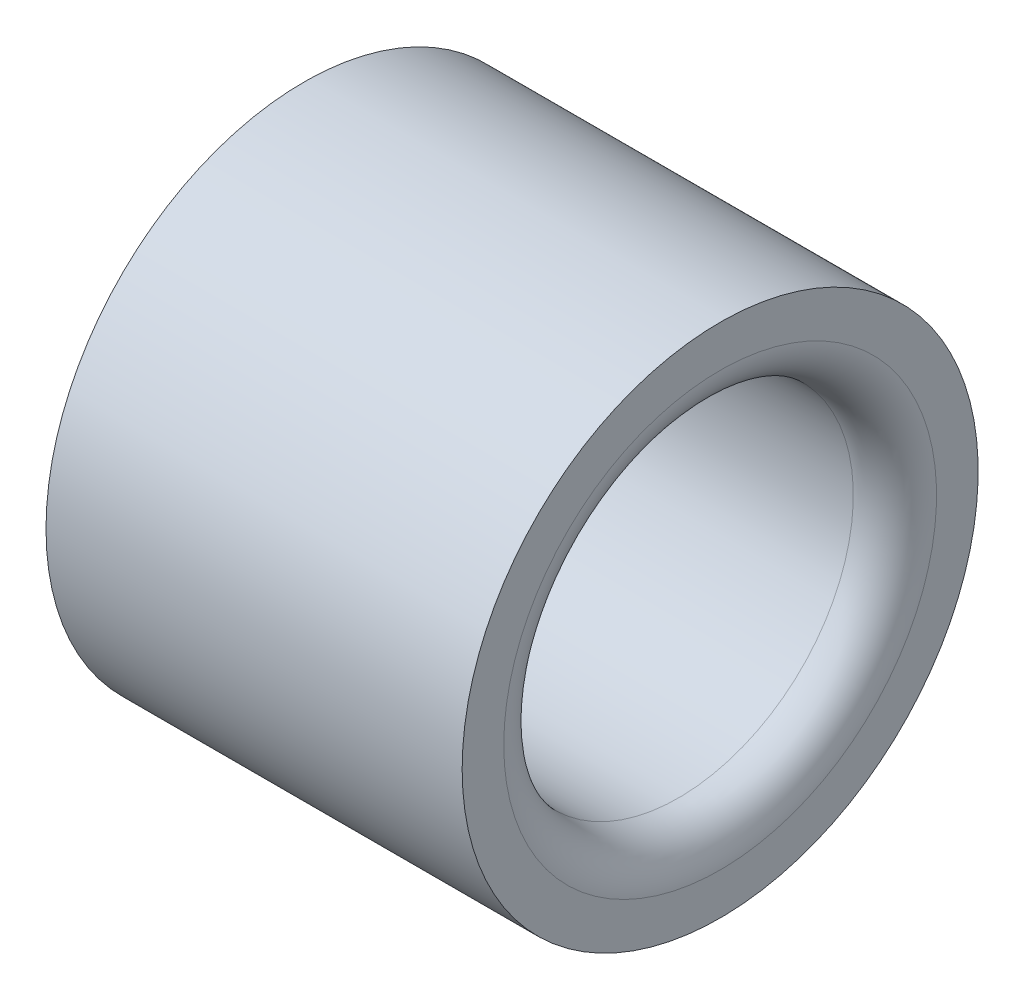
ISO-10303-21;
HEADER;
FILE_DESCRIPTION(('STEP AP214'),'2;1');
FILE_NAME('part.step','',(''),(''),'','','');
FILE_SCHEMA(('AUTOMOTIVE_DESIGN { 1 0 10303 214 1 1 1 1 }'));
ENDSEC;
DATA;
#1=APPLICATION_CONTEXT('core data for automotive mechanical design processes');
#2=APPLICATION_PROTOCOL_DEFINITION('international standard','automotive_design',2000,#1);
#3=PRODUCT_CONTEXT('',#1,'mechanical');
#4=PRODUCT('Part','Part','',(#3));
#5=PRODUCT_RELATED_PRODUCT_CATEGORY('part','',(#4));
#6=PRODUCT_DEFINITION_FORMATION('','',#4);
#7=PRODUCT_DEFINITION_CONTEXT('part definition',#1,'design');
#8=PRODUCT_DEFINITION('design','',#6,#7);
#9=PRODUCT_DEFINITION_SHAPE('','',#8);
#10=(LENGTH_UNIT() NAMED_UNIT(*) SI_UNIT(.MILLI.,.METRE.));
#11=(NAMED_UNIT(*) PLANE_ANGLE_UNIT() SI_UNIT($,.RADIAN.));
#12=(NAMED_UNIT(*) SI_UNIT($,.STERADIAN.) SOLID_ANGLE_UNIT());
#13=UNCERTAINTY_MEASURE_WITH_UNIT(LENGTH_MEASURE(1.E-05),#10,'distance_accuracy_value','');
#14=(GEOMETRIC_REPRESENTATION_CONTEXT(3) GLOBAL_UNCERTAINTY_ASSIGNED_CONTEXT((#13)) GLOBAL_UNIT_ASSIGNED_CONTEXT((#10,
#11,#12)) REPRESENTATION_CONTEXT('',''));
#15=CARTESIAN_POINT('',(0.,0.,0.));
#16=DIRECTION('',(0.,0.,1.));
#17=DIRECTION('',(1.,0.,0.));
#18=AXIS2_PLACEMENT_3D('',#15,#16,#17);
#19=CARTESIAN_POINT('',(0.,6.2,0.));
#20=DIRECTION('',(1.,0.,0.));
#21=DIRECTION('',(0.,0.,-1.));
#22=AXIS2_PLACEMENT_3D('',#19,#20,#21);
#23=PLANE('',#22);
#24=CARTESIAN_POINT('',(0.,0.,0.));
#25=DIRECTION('',(-1.,0.,0.));
#26=DIRECTION('',(0.,0.,1.));
#27=AXIS2_PLACEMENT_3D('',#24,#25,#26);
#28=CIRCLE('',#27,2.7);
#29=CARTESIAN_POINT('',(0.,0.,2.7));
#30=VERTEX_POINT('',#29);
#31=EDGE_CURVE('E46',#30,#30,#28,.T.);
#32=ORIENTED_EDGE('',*,*,#31,.F.);
#33=EDGE_LOOP('',(#32));
#34=FACE_BOUND('',#33,.T.);
#35=CARTESIAN_POINT('',(0.,0.,0.));
#36=DIRECTION('',(-1.,0.,0.));
#37=DIRECTION('',(0.,0.,1.));
#38=AXIS2_PLACEMENT_3D('',#35,#36,#37);
#39=CIRCLE('',#38,6.2);
#40=CARTESIAN_POINT('',(0.,0.,6.2));
#41=VERTEX_POINT('',#40);
#42=EDGE_CURVE('E61',#41,#41,#39,.T.);
#43=ORIENTED_EDGE('',*,*,#42,.T.);
#44=EDGE_LOOP('',(#43));
#45=FACE_BOUND('',#44,.T.);
#46=ADVANCED_FACE('F35',(#34,#45),#23,.F.);
#47=CARTESIAN_POINT('',(0.,0.,0.));
#48=DIRECTION('',(-1.,0.,0.));
#49=DIRECTION('',(0.,0.,1.));
#50=AXIS2_PLACEMENT_3D('',#47,#48,#49);
#51=CYLINDRICAL_SURFACE('',#50,2.7);
#52=CARTESIAN_POINT('',(1.42361111111111,0.,0.));
#53=DIRECTION('',(-1.,0.,0.));
#54=DIRECTION('',(0.,0.,1.));
#55=AXIS2_PLACEMENT_3D('',#52,#53,#54);
#56=CIRCLE('',#55,2.7);
#57=CARTESIAN_POINT('',(1.42361111111111,0.,2.7));
#58=VERTEX_POINT('',#57);
#59=EDGE_CURVE('E50',#58,#58,#56,.T.);
#60=ORIENTED_EDGE('',*,*,#59,.F.);
#61=EDGE_LOOP('',(#60));
#62=FACE_BOUND('',#61,.T.);
#63=ORIENTED_EDGE('',*,*,#31,.T.);
#64=EDGE_LOOP('',(#63));
#65=FACE_BOUND('',#64,.T.);
#66=ADVANCED_FACE('F82',(#62,#65),#51,.F.);
#67=CARTESIAN_POINT('',(1.42361111111111,2.7,0.));
#68=DIRECTION('',(-1.,0.,0.));
#69=DIRECTION('',(0.,0.,1.));
#70=AXIS2_PLACEMENT_3D('',#67,#68,#69);
#71=PLANE('',#70);
#72=CARTESIAN_POINT('',(1.42361111111111,0.,0.));
#73=DIRECTION('',(-1.,0.,0.));
#74=DIRECTION('',(0.,0.,1.));
#75=AXIS2_PLACEMENT_3D('',#72,#73,#74);
#76=CIRCLE('',#75,4.2);
#77=CARTESIAN_POINT('',(1.42361111111111,0.,4.2));
#78=VERTEX_POINT('',#77);
#79=EDGE_CURVE('E55',#78,#78,#76,.T.);
#80=ORIENTED_EDGE('',*,*,#79,.F.);
#81=EDGE_LOOP('',(#80));
#82=FACE_BOUND('',#81,.T.);
#83=ORIENTED_EDGE('',*,*,#59,.T.);
#84=EDGE_LOOP('',(#83));
#85=FACE_BOUND('',#84,.T.);
#86=ADVANCED_FACE('F79',(#82,#85),#71,.F.);
#87=CARTESIAN_POINT('',(0.,0.,0.));
#88=DIRECTION('',(-1.,0.,0.));
#89=DIRECTION('',(0.,0.,1.));
#90=AXIS2_PLACEMENT_3D('',#87,#88,#89);
#91=CYLINDRICAL_SURFACE('',#90,4.2);
#92=CARTESIAN_POINT('',(9.,0.,0.));
#93=DIRECTION('',(-1.,0.,0.));
#94=DIRECTION('',(0.,0.,1.));
#95=AXIS2_PLACEMENT_3D('',#92,#93,#94);
#96=CIRCLE('',#95,4.2);
#97=CARTESIAN_POINT('',(9.,0.,4.2));
#98=VERTEX_POINT('',#97);
#99=EDGE_CURVE('E10',#98,#98,#96,.F.);
#100=ORIENTED_EDGE('',*,*,#99,.T.);
#101=EDGE_LOOP('',(#100));
#102=FACE_BOUND('',#101,.T.);
#103=ORIENTED_EDGE('',*,*,#79,.T.);
#104=EDGE_LOOP('',(#103));
#105=FACE_BOUND('',#104,.T.);
#106=ADVANCED_FACE('F74',(#102,#105),#91,.F.);
#107=CARTESIAN_POINT('',(10.,4.2,0.));
#108=DIRECTION('',(-1.,0.,0.));
#109=DIRECTION('',(0.,0.,1.));
#110=AXIS2_PLACEMENT_3D('',#107,#108,#109);
#111=PLANE('',#110);
#112=CARTESIAN_POINT('',(10.,0.,0.));
#113=DIRECTION('',(-1.,0.,0.));
#114=DIRECTION('',(0.,0.,1.));
#115=AXIS2_PLACEMENT_3D('',#112,#113,#114);
#116=CIRCLE('',#115,5.2);
#117=CARTESIAN_POINT('',(10.,0.,5.2));
#118=VERTEX_POINT('',#117);
#119=EDGE_CURVE('E42',#118,#118,#116,.T.);
#120=ORIENTED_EDGE('',*,*,#119,.T.);
#121=EDGE_LOOP('',(#120));
#122=FACE_BOUND('',#121,.T.);
#123=CARTESIAN_POINT('',(10.,0.,0.));
#124=DIRECTION('',(-1.,0.,0.));
#125=DIRECTION('',(0.,0.,1.));
#126=AXIS2_PLACEMENT_3D('',#123,#124,#125);
#127=CIRCLE('',#126,6.2);
#128=CARTESIAN_POINT('',(10.,0.,6.2));
#129=VERTEX_POINT('',#128);
#130=EDGE_CURVE('E58',#129,#129,#127,.T.);
#131=ORIENTED_EDGE('',*,*,#130,.F.);
#132=EDGE_LOOP('',(#131));
#133=FACE_BOUND('',#132,.T.);
#134=ADVANCED_FACE('F69',(#122,#133),#111,.F.);
#135=CARTESIAN_POINT('',(0.,0.,0.));
#136=DIRECTION('',(-1.,0.,0.));
#137=DIRECTION('',(0.,0.,1.));
#138=AXIS2_PLACEMENT_3D('',#135,#136,#137);
#139=CYLINDRICAL_SURFACE('',#138,6.2);
#140=ORIENTED_EDGE('',*,*,#42,.F.);
#141=EDGE_LOOP('',(#140));
#142=FACE_BOUND('',#141,.T.);
#143=ORIENTED_EDGE('',*,*,#130,.T.);
#144=EDGE_LOOP('',(#143));
#145=FACE_BOUND('',#144,.T.);
#146=ADVANCED_FACE('F66',(#142,#145),#139,.T.);
#147=CARTESIAN_POINT('',(9.,0.,0.));
#148=DIRECTION('',(-1.,0.,0.));
#149=DIRECTION('',(0.,0.,1.));
#150=AXIS2_PLACEMENT_3D('',#147,#148,#149);
#151=TOROIDAL_SURFACE('',#150,5.2,1.);
#152=ORIENTED_EDGE('',*,*,#99,.F.);
#153=EDGE_LOOP('',(#152));
#154=FACE_BOUND('',#153,.T.);
#155=ORIENTED_EDGE('',*,*,#119,.F.);
#156=EDGE_LOOP('',(#155));
#157=FACE_BOUND('',#156,.T.);
#158=ADVANCED_FACE('F37',(#154,#157),#151,.T.);
#159=CLOSED_SHELL('',(#46,#66,#86,#106,#134,#146,#158));
#160=MANIFOLD_SOLID_BREP('B2',#159);
#161=ADVANCED_BREP_SHAPE_REPRESENTATION('',(#18,#160),#14);
#162=SHAPE_DEFINITION_REPRESENTATION(#9,#161);
ENDSEC;
END-ISO-10303-21;
